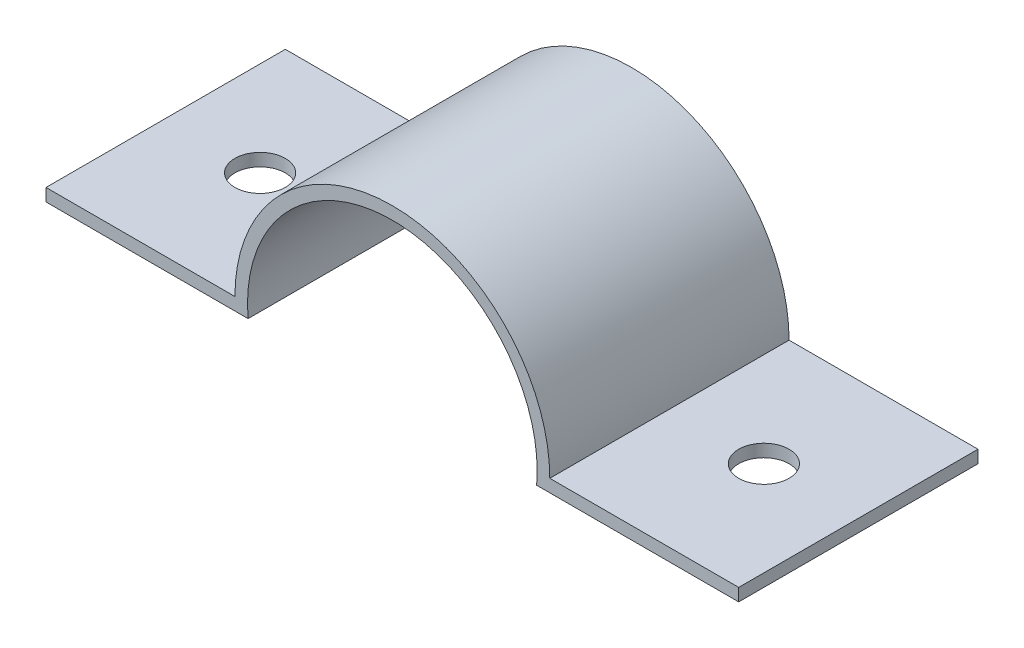
ISO-10303-21;
HEADER;
FILE_DESCRIPTION(('STEP AP214'),'2;1');
FILE_NAME('part.step','',(''),(''),'','','');
FILE_SCHEMA(('AUTOMOTIVE_DESIGN { 1 0 10303 214 1 1 1 1 }'));
ENDSEC;
DATA;
#1=APPLICATION_CONTEXT('core data for automotive mechanical design processes');
#2=APPLICATION_PROTOCOL_DEFINITION('international standard','automotive_design',2000,#1);
#3=PRODUCT_CONTEXT('',#1,'mechanical');
#4=PRODUCT('Part','Part','',(#3));
#5=PRODUCT_RELATED_PRODUCT_CATEGORY('part','',(#4));
#6=PRODUCT_DEFINITION_FORMATION('','',#4);
#7=PRODUCT_DEFINITION_CONTEXT('part definition',#1,'design');
#8=PRODUCT_DEFINITION('design','',#6,#7);
#9=PRODUCT_DEFINITION_SHAPE('','',#8);
#10=(LENGTH_UNIT() NAMED_UNIT(*) SI_UNIT(.MILLI.,.METRE.));
#11=(NAMED_UNIT(*) PLANE_ANGLE_UNIT() SI_UNIT($,.RADIAN.));
#12=(NAMED_UNIT(*) SI_UNIT($,.STERADIAN.) SOLID_ANGLE_UNIT());
#13=UNCERTAINTY_MEASURE_WITH_UNIT(LENGTH_MEASURE(1.E-05),#10,'distance_accuracy_value','');
#14=(GEOMETRIC_REPRESENTATION_CONTEXT(3) GLOBAL_UNCERTAINTY_ASSIGNED_CONTEXT((#13)) GLOBAL_UNIT_ASSIGNED_CONTEXT((#10,
#11,#12)) REPRESENTATION_CONTEXT('',''));
#15=CARTESIAN_POINT('',(0.,0.,0.));
#16=DIRECTION('',(0.,0.,1.));
#17=DIRECTION('',(1.,0.,0.));
#18=AXIS2_PLACEMENT_3D('',#15,#16,#17);
#19=CARTESIAN_POINT('',(0.,0.,19.));
#20=DIRECTION('',(1.,0.,0.));
#21=DIRECTION('',(0.,1.,0.));
#22=AXIS2_PLACEMENT_3D('',#19,#20,#21);
#23=PLANE('',#22);
#24=DIRECTION('',(0.,-1.,0.));
#25=VECTOR('',#24,1.);
#26=CARTESIAN_POINT('',(0.,0.,0.));
#27=LINE('',#26,#25);
#28=CARTESIAN_POINT('',(0.,0.,0.));
#29=VERTEX_POINT('',#28);
#30=CARTESIAN_POINT('',(0.,-1.,0.));
#31=VERTEX_POINT('',#30);
#32=EDGE_CURVE('E132',#29,#31,#27,.T.);
#33=ORIENTED_EDGE('',*,*,#32,.T.);
#34=DIRECTION('',(0.,0.,-1.));
#35=VECTOR('',#34,1.);
#36=CARTESIAN_POINT('',(0.,-1.,19.));
#37=LINE('',#36,#35);
#38=CARTESIAN_POINT('',(0.,-1.,19.));
#39=VERTEX_POINT('',#38);
#40=EDGE_CURVE('E11',#39,#31,#37,.T.);
#41=ORIENTED_EDGE('',*,*,#40,.F.);
#42=DIRECTION('',(0.,-1.,0.));
#43=VECTOR('',#42,1.);
#44=CARTESIAN_POINT('',(0.,0.,19.));
#45=LINE('',#44,#43);
#46=CARTESIAN_POINT('',(0.,0.,19.));
#47=VERTEX_POINT('',#46);
#48=EDGE_CURVE('E147',#47,#39,#45,.T.);
#49=ORIENTED_EDGE('',*,*,#48,.F.);
#50=DIRECTION('',(0.,0.,-1.));
#51=VECTOR('',#50,1.);
#52=CARTESIAN_POINT('',(0.,0.,19.));
#53=LINE('',#52,#51);
#54=EDGE_CURVE('E128',#47,#29,#53,.T.);
#55=ORIENTED_EDGE('',*,*,#54,.T.);
#56=EDGE_LOOP('',(#33,#41,#49,#55));
#57=FACE_BOUND('',#56,.T.);
#58=ADVANCED_FACE('F36',(#57),#23,.F.);
#59=CARTESIAN_POINT('',(16.,-1.,19.));
#60=DIRECTION('',(0.,1.,0.));
#61=DIRECTION('',(0.,0.,1.));
#62=AXIS2_PLACEMENT_3D('',#59,#60,#61);
#63=PLANE('',#62);
#64=CARTESIAN_POINT('',(7.5,-1.,9.5));
#65=DIRECTION('',(0.,1.,0.));
#66=DIRECTION('',(0.,0.,1.));
#67=AXIS2_PLACEMENT_3D('',#64,#65,#66);
#68=CIRCLE('',#67,2.);
#69=CARTESIAN_POINT('',(7.5,-1.,11.5));
#70=VERTEX_POINT('',#69);
#71=EDGE_CURVE('E182',#70,#70,#68,.T.);
#72=ORIENTED_EDGE('',*,*,#71,.T.);
#73=EDGE_LOOP('',(#72));
#74=FACE_BOUND('',#73,.T.);
#75=DIRECTION('',(1.,0.,0.));
#76=VECTOR('',#75,1.);
#77=CARTESIAN_POINT('',(16.,-1.,0.));
#78=LINE('',#77,#76);
#79=CARTESIAN_POINT('',(16.0435607626104,-1.,0.));
#80=VERTEX_POINT('',#79);
#81=EDGE_CURVE('E135',#31,#80,#78,.T.);
#82=ORIENTED_EDGE('',*,*,#81,.T.);
#83=DIRECTION('',(0.,0.,-1.));
#84=VECTOR('',#83,1.);
#85=CARTESIAN_POINT('',(16.0435607626104,-1.,19.));
#86=LINE('',#85,#84);
#87=CARTESIAN_POINT('',(16.0435607626104,-1.,19.));
#88=VERTEX_POINT('',#87);
#89=EDGE_CURVE('E44',#88,#80,#86,.T.);
#90=ORIENTED_EDGE('',*,*,#89,.F.);
#91=DIRECTION('',(1.,0.,0.));
#92=VECTOR('',#91,1.);
#93=CARTESIAN_POINT('',(0.,-1.,19.));
#94=LINE('',#93,#92);
#95=EDGE_CURVE('E95',#39,#88,#94,.T.);
#96=ORIENTED_EDGE('',*,*,#95,.F.);
#97=ORIENTED_EDGE('',*,*,#40,.T.);
#98=EDGE_LOOP('',(#82,#90,#96,#97));
#99=FACE_BOUND('',#98,.T.);
#100=ADVANCED_FACE('F206',(#74,#99),#63,.F.);
#101=CARTESIAN_POINT('',(27.5,0.,19.));
#102=DIRECTION('',(0.,0.,-1.));
#103=DIRECTION('',(-1.,0.,0.));
#104=AXIS2_PLACEMENT_3D('',#101,#102,#103);
#105=CYLINDRICAL_SURFACE('',#104,11.5);
#106=CARTESIAN_POINT('',(27.5,0.,0.));
#107=DIRECTION('',(0.,0.,-1.));
#108=DIRECTION('',(1.,0.,0.));
#109=AXIS2_PLACEMENT_3D('',#106,#107,#108);
#110=CIRCLE('',#109,11.5);
#111=CARTESIAN_POINT('',(38.9564392373896,-1.,0.));
#112=VERTEX_POINT('',#111);
#113=EDGE_CURVE('E138',#80,#112,#110,.T.);
#114=ORIENTED_EDGE('',*,*,#113,.T.);
#115=DIRECTION('',(0.,0.,-1.));
#116=VECTOR('',#115,1.);
#117=CARTESIAN_POINT('',(38.9564392373896,-1.,19.));
#118=LINE('',#117,#116);
#119=CARTESIAN_POINT('',(38.9564392373896,-1.,19.));
#120=VERTEX_POINT('',#119);
#121=EDGE_CURVE('E154',#120,#112,#118,.T.);
#122=ORIENTED_EDGE('',*,*,#121,.F.);
#123=CARTESIAN_POINT('',(27.5,0.,19.));
#124=DIRECTION('',(0.,0.,-1.));
#125=DIRECTION('',(1.,0.,0.));
#126=AXIS2_PLACEMENT_3D('',#123,#124,#125);
#127=CIRCLE('',#126,11.5);
#128=EDGE_CURVE('E162',#88,#120,#127,.T.);
#129=ORIENTED_EDGE('',*,*,#128,.F.);
#130=ORIENTED_EDGE('',*,*,#89,.T.);
#131=EDGE_LOOP('',(#114,#122,#129,#130));
#132=FACE_BOUND('',#131,.T.);
#133=ADVANCED_FACE('F160',(#132),#105,.F.);
#134=CARTESIAN_POINT('',(38.9564392373896,-1.,19.));
#135=DIRECTION('',(0.,1.,0.));
#136=DIRECTION('',(0.,0.,1.));
#137=AXIS2_PLACEMENT_3D('',#134,#135,#136);
#138=PLANE('',#137);
#139=CARTESIAN_POINT('',(47.5,-1.,9.5));
#140=DIRECTION('',(0.,1.,0.));
#141=DIRECTION('',(0.,0.,1.));
#142=AXIS2_PLACEMENT_3D('',#139,#140,#141);
#143=CIRCLE('',#142,2.);
#144=CARTESIAN_POINT('',(47.5,-1.,11.5));
#145=VERTEX_POINT('',#144);
#146=EDGE_CURVE('E136',#145,#145,#143,.T.);
#147=ORIENTED_EDGE('',*,*,#146,.T.);
#148=EDGE_LOOP('',(#147));
#149=FACE_BOUND('',#148,.T.);
#150=DIRECTION('',(1.,0.,0.));
#151=VECTOR('',#150,1.);
#152=CARTESIAN_POINT('',(38.9564392373896,-1.,0.));
#153=LINE('',#152,#151);
#154=CARTESIAN_POINT('',(55.,-1.,0.));
#155=VERTEX_POINT('',#154);
#156=EDGE_CURVE('E140',#112,#155,#153,.T.);
#157=ORIENTED_EDGE('',*,*,#156,.T.);
#158=DIRECTION('',(0.,0.,-1.));
#159=VECTOR('',#158,1.);
#160=CARTESIAN_POINT('',(55.,-1.,19.));
#161=LINE('',#160,#159);
#162=CARTESIAN_POINT('',(55.,-1.,19.));
#163=VERTEX_POINT('',#162);
#164=EDGE_CURVE('E151',#163,#155,#161,.T.);
#165=ORIENTED_EDGE('',*,*,#164,.F.);
#166=DIRECTION('',(1.,0.,0.));
#167=VECTOR('',#166,1.);
#168=CARTESIAN_POINT('',(38.9564392373896,-1.,19.));
#169=LINE('',#168,#167);
#170=EDGE_CURVE('E174',#120,#163,#169,.T.);
#171=ORIENTED_EDGE('',*,*,#170,.F.);
#172=ORIENTED_EDGE('',*,*,#121,.T.);
#173=EDGE_LOOP('',(#157,#165,#171,#172));
#174=FACE_BOUND('',#173,.T.);
#175=ADVANCED_FACE('F170',(#149,#174),#138,.F.);
#176=CARTESIAN_POINT('',(55.,-1.,19.));
#177=DIRECTION('',(-1.,0.,0.));
#178=DIRECTION('',(0.,0.,1.));
#179=AXIS2_PLACEMENT_3D('',#176,#177,#178);
#180=PLANE('',#179);
#181=DIRECTION('',(0.,1.,0.));
#182=VECTOR('',#181,1.);
#183=CARTESIAN_POINT('',(55.,-1.,0.));
#184=LINE('',#183,#182);
#185=CARTESIAN_POINT('',(55.,0.,0.));
#186=VERTEX_POINT('',#185);
#187=EDGE_CURVE('E142',#155,#186,#184,.T.);
#188=ORIENTED_EDGE('',*,*,#187,.T.);
#189=DIRECTION('',(0.,0.,-1.));
#190=VECTOR('',#189,1.);
#191=CARTESIAN_POINT('',(55.,0.,19.));
#192=LINE('',#191,#190);
#193=CARTESIAN_POINT('',(55.,0.,19.));
#194=VERTEX_POINT('',#193);
#195=EDGE_CURVE('E123',#194,#186,#192,.T.);
#196=ORIENTED_EDGE('',*,*,#195,.F.);
#197=DIRECTION('',(0.,1.,0.));
#198=VECTOR('',#197,1.);
#199=CARTESIAN_POINT('',(55.,-1.,19.));
#200=LINE('',#199,#198);
#201=EDGE_CURVE('E114',#163,#194,#200,.T.);
#202=ORIENTED_EDGE('',*,*,#201,.F.);
#203=ORIENTED_EDGE('',*,*,#164,.T.);
#204=EDGE_LOOP('',(#188,#196,#202,#203));
#205=FACE_BOUND('',#204,.T.);
#206=ADVANCED_FACE('F173',(#205),#180,.F.);
#207=CARTESIAN_POINT('',(40.,0.,19.));
#208=DIRECTION('',(0.,-1.,0.));
#209=DIRECTION('',(0.,0.,-1.));
#210=AXIS2_PLACEMENT_3D('',#207,#208,#209);
#211=PLANE('',#210);
#212=CARTESIAN_POINT('',(47.5,0.,9.5));
#213=DIRECTION('',(0.,1.,0.));
#214=DIRECTION('',(0.,0.,1.));
#215=AXIS2_PLACEMENT_3D('',#212,#213,#214);
#216=CIRCLE('',#215,2.);
#217=CARTESIAN_POINT('',(47.5,0.,11.5));
#218=VERTEX_POINT('',#217);
#219=EDGE_CURVE('E186',#218,#218,#216,.T.);
#220=ORIENTED_EDGE('',*,*,#219,.F.);
#221=EDGE_LOOP('',(#220));
#222=FACE_BOUND('',#221,.T.);
#223=DIRECTION('',(-1.,0.,0.));
#224=VECTOR('',#223,1.);
#225=CARTESIAN_POINT('',(40.,0.,0.));
#226=LINE('',#225,#224);
#227=CARTESIAN_POINT('',(40.,0.,0.));
#228=VERTEX_POINT('',#227);
#229=EDGE_CURVE('E122',#186,#228,#226,.T.);
#230=ORIENTED_EDGE('',*,*,#229,.T.);
#231=DIRECTION('',(0.,0.,-1.));
#232=VECTOR('',#231,1.);
#233=CARTESIAN_POINT('',(40.,0.,19.));
#234=LINE('',#233,#232);
#235=CARTESIAN_POINT('',(40.,0.,19.));
#236=VERTEX_POINT('',#235);
#237=EDGE_CURVE('E119',#236,#228,#234,.T.);
#238=ORIENTED_EDGE('',*,*,#237,.F.);
#239=DIRECTION('',(-1.,0.,0.));
#240=VECTOR('',#239,1.);
#241=CARTESIAN_POINT('',(40.,0.,19.));
#242=LINE('',#241,#240);
#243=EDGE_CURVE('E108',#194,#236,#242,.T.);
#244=ORIENTED_EDGE('',*,*,#243,.F.);
#245=ORIENTED_EDGE('',*,*,#195,.T.);
#246=EDGE_LOOP('',(#230,#238,#244,#245));
#247=FACE_BOUND('',#246,.T.);
#248=ADVANCED_FACE('F120',(#222,#247),#211,.F.);
#249=CARTESIAN_POINT('',(27.5,0.,19.));
#250=DIRECTION('',(0.,0.,-1.));
#251=DIRECTION('',(-1.,0.,0.));
#252=AXIS2_PLACEMENT_3D('',#249,#250,#251);
#253=CYLINDRICAL_SURFACE('',#252,12.5);
#254=CARTESIAN_POINT('',(27.5,0.,0.));
#255=DIRECTION('',(0.,0.,1.));
#256=DIRECTION('',(1.,0.,0.));
#257=AXIS2_PLACEMENT_3D('',#254,#255,#256);
#258=CIRCLE('',#257,12.5);
#259=CARTESIAN_POINT('',(15.,0.,0.));
#260=VERTEX_POINT('',#259);
#261=EDGE_CURVE('E81',#228,#260,#258,.T.);
#262=ORIENTED_EDGE('',*,*,#261,.T.);
#263=DIRECTION('',(0.,0.,-1.));
#264=VECTOR('',#263,1.);
#265=CARTESIAN_POINT('',(15.,0.,19.));
#266=LINE('',#265,#264);
#267=CARTESIAN_POINT('',(15.,0.,19.));
#268=VERTEX_POINT('',#267);
#269=EDGE_CURVE('E124',#268,#260,#266,.T.);
#270=ORIENTED_EDGE('',*,*,#269,.F.);
#271=CARTESIAN_POINT('',(27.5,0.,19.));
#272=DIRECTION('',(0.,0.,1.));
#273=DIRECTION('',(1.,0.,0.));
#274=AXIS2_PLACEMENT_3D('',#271,#272,#273);
#275=CIRCLE('',#274,12.5);
#276=EDGE_CURVE('E112',#236,#268,#275,.T.);
#277=ORIENTED_EDGE('',*,*,#276,.F.);
#278=ORIENTED_EDGE('',*,*,#237,.T.);
#279=EDGE_LOOP('',(#262,#270,#277,#278));
#280=FACE_BOUND('',#279,.T.);
#281=ADVANCED_FACE('F126',(#280),#253,.T.);
#282=CARTESIAN_POINT('',(0.,0.,19.));
#283=DIRECTION('',(0.,-1.,0.));
#284=DIRECTION('',(0.,0.,-1.));
#285=AXIS2_PLACEMENT_3D('',#282,#283,#284);
#286=PLANE('',#285);
#287=CARTESIAN_POINT('',(7.5,0.,9.5));
#288=DIRECTION('',(0.,1.,0.));
#289=DIRECTION('',(0.,0.,1.));
#290=AXIS2_PLACEMENT_3D('',#287,#288,#289);
#291=CIRCLE('',#290,2.);
#292=CARTESIAN_POINT('',(7.5,0.,11.5));
#293=VERTEX_POINT('',#292);
#294=EDGE_CURVE('E185',#293,#293,#291,.T.);
#295=ORIENTED_EDGE('',*,*,#294,.F.);
#296=EDGE_LOOP('',(#295));
#297=FACE_BOUND('',#296,.T.);
#298=DIRECTION('',(-1.,0.,0.));
#299=VECTOR('',#298,1.);
#300=CARTESIAN_POINT('',(0.,0.,0.));
#301=LINE('',#300,#299);
#302=EDGE_CURVE('E87',#260,#29,#301,.T.);
#303=ORIENTED_EDGE('',*,*,#302,.T.);
#304=ORIENTED_EDGE('',*,*,#54,.F.);
#305=DIRECTION('',(-1.,0.,0.));
#306=VECTOR('',#305,1.);
#307=CARTESIAN_POINT('',(0.,0.,19.));
#308=LINE('',#307,#306);
#309=EDGE_CURVE('E52',#268,#47,#308,.T.);
#310=ORIENTED_EDGE('',*,*,#309,.F.);
#311=ORIENTED_EDGE('',*,*,#269,.T.);
#312=EDGE_LOOP('',(#303,#304,#310,#311));
#313=FACE_BOUND('',#312,.T.);
#314=ADVANCED_FACE('F195',(#297,#313),#286,.F.);
#315=CARTESIAN_POINT('',(27.5,0.,19.));
#316=DIRECTION('',(0.,0.,1.));
#317=DIRECTION('',(1.,0.,0.));
#318=AXIS2_PLACEMENT_3D('',#315,#316,#317);
#319=PLANE('',#318);
#320=ORIENTED_EDGE('',*,*,#48,.T.);
#321=ORIENTED_EDGE('',*,*,#95,.T.);
#322=ORIENTED_EDGE('',*,*,#128,.T.);
#323=ORIENTED_EDGE('',*,*,#170,.T.);
#324=ORIENTED_EDGE('',*,*,#201,.T.);
#325=ORIENTED_EDGE('',*,*,#243,.T.);
#326=ORIENTED_EDGE('',*,*,#276,.T.);
#327=ORIENTED_EDGE('',*,*,#309,.T.);
#328=EDGE_LOOP('',(#320,#321,#322,#323,#324,#325,#326,#327));
#329=FACE_BOUND('',#328,.T.);
#330=ADVANCED_FACE('F110',(#329),#319,.T.);
#331=CARTESIAN_POINT('',(27.5,0.,0.));
#332=DIRECTION('',(0.,0.,1.));
#333=DIRECTION('',(1.,0.,0.));
#334=AXIS2_PLACEMENT_3D('',#331,#332,#333);
#335=PLANE('',#334);
#336=ORIENTED_EDGE('',*,*,#32,.F.);
#337=ORIENTED_EDGE('',*,*,#302,.F.);
#338=ORIENTED_EDGE('',*,*,#261,.F.);
#339=ORIENTED_EDGE('',*,*,#229,.F.);
#340=ORIENTED_EDGE('',*,*,#187,.F.);
#341=ORIENTED_EDGE('',*,*,#156,.F.);
#342=ORIENTED_EDGE('',*,*,#113,.F.);
#343=ORIENTED_EDGE('',*,*,#81,.F.);
#344=EDGE_LOOP('',(#336,#337,#338,#339,#340,#341,#342,#343));
#345=FACE_BOUND('',#344,.T.);
#346=ADVANCED_FACE('F166',(#345),#335,.F.);
#347=CARTESIAN_POINT('',(7.5,-19.,9.5));
#348=DIRECTION('',(0.,1.,0.));
#349=DIRECTION('',(0.,0.,1.));
#350=AXIS2_PLACEMENT_3D('',#347,#348,#349);
#351=CYLINDRICAL_SURFACE('',#350,2.);
#352=ORIENTED_EDGE('',*,*,#294,.T.);
#353=EDGE_LOOP('',(#352));
#354=FACE_BOUND('',#353,.T.);
#355=ORIENTED_EDGE('',*,*,#71,.F.);
#356=EDGE_LOOP('',(#355));
#357=FACE_BOUND('',#356,.T.);
#358=ADVANCED_FACE('F192',(#354,#357),#351,.F.);
#359=CARTESIAN_POINT('',(47.5,-19.,9.5));
#360=DIRECTION('',(0.,1.,0.));
#361=DIRECTION('',(0.,0.,1.));
#362=AXIS2_PLACEMENT_3D('',#359,#360,#361);
#363=CYLINDRICAL_SURFACE('',#362,2.);
#364=ORIENTED_EDGE('',*,*,#219,.T.);
#365=EDGE_LOOP('',(#364));
#366=FACE_BOUND('',#365,.T.);
#367=ORIENTED_EDGE('',*,*,#146,.F.);
#368=EDGE_LOOP('',(#367));
#369=FACE_BOUND('',#368,.T.);
#370=ADVANCED_FACE('F230',(#366,#369),#363,.F.);
#371=CLOSED_SHELL('',(#58,#100,#133,#175,#206,#248,#281,#314,#330,#346,#358,#370));
#372=MANIFOLD_SOLID_BREP('B2',#371);
#373=ADVANCED_BREP_SHAPE_REPRESENTATION('',(#18,#372),#14);
#374=SHAPE_DEFINITION_REPRESENTATION(#9,#373);
ENDSEC;
END-ISO-10303-21;
